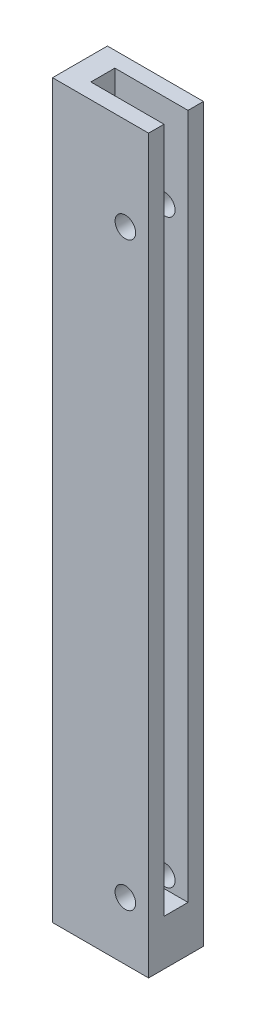
ISO-10303-21;
HEADER;
FILE_DESCRIPTION(('STEP AP214'),'2;1');
FILE_NAME('part.step','',(''),(''),'','','');
FILE_SCHEMA(('AUTOMOTIVE_DESIGN { 1 0 10303 214 1 1 1 1 }'));
ENDSEC;
DATA;
#1=APPLICATION_CONTEXT('core data for automotive mechanical design processes');
#2=APPLICATION_PROTOCOL_DEFINITION('international standard','automotive_design',2000,#1);
#3=PRODUCT_CONTEXT('',#1,'mechanical');
#4=PRODUCT('Part','Part','',(#3));
#5=PRODUCT_RELATED_PRODUCT_CATEGORY('part','',(#4));
#6=PRODUCT_DEFINITION_FORMATION('','',#4);
#7=PRODUCT_DEFINITION_CONTEXT('part definition',#1,'design');
#8=PRODUCT_DEFINITION('design','',#6,#7);
#9=PRODUCT_DEFINITION_SHAPE('','',#8);
#10=(LENGTH_UNIT() NAMED_UNIT(*) SI_UNIT(.MILLI.,.METRE.));
#11=(NAMED_UNIT(*) PLANE_ANGLE_UNIT() SI_UNIT($,.RADIAN.));
#12=(NAMED_UNIT(*) SI_UNIT($,.STERADIAN.) SOLID_ANGLE_UNIT());
#13=UNCERTAINTY_MEASURE_WITH_UNIT(LENGTH_MEASURE(1.E-05),#10,'distance_accuracy_value','');
#14=(GEOMETRIC_REPRESENTATION_CONTEXT(3) GLOBAL_UNCERTAINTY_ASSIGNED_CONTEXT((#13)) GLOBAL_UNIT_ASSIGNED_CONTEXT((#10,
#11,#12)) REPRESENTATION_CONTEXT('',''));
#15=CARTESIAN_POINT('',(0.,0.,0.));
#16=DIRECTION('',(0.,0.,1.));
#17=DIRECTION('',(1.,0.,0.));
#18=AXIS2_PLACEMENT_3D('',#15,#16,#17);
#19=CARTESIAN_POINT('',(15.92,12.7,12.));
#20=DIRECTION('',(0.,0.,-1.));
#21=DIRECTION('',(-1.,0.,0.));
#22=AXIS2_PLACEMENT_3D('',#19,#20,#21);
#23=CYLINDRICAL_SURFACE('',#22,2.2479);
#24=CARTESIAN_POINT('',(15.92,12.7,8.62499999999997));
#25=DIRECTION('',(0.,0.,1.));
#26=DIRECTION('',(0.,-1.,0.));
#27=AXIS2_PLACEMENT_3D('',#24,#25,#26);
#28=CIRCLE('',#27,2.2479);
#29=CARTESIAN_POINT('',(15.92,10.4521,8.62499999999997));
#30=VERTEX_POINT('',#29);
#31=EDGE_CURVE('E147',#30,#30,#28,.T.);
#32=ORIENTED_EDGE('',*,*,#31,.F.);
#33=EDGE_LOOP('',(#32));
#34=FACE_BOUND('',#33,.T.);
#35=CARTESIAN_POINT('',(15.92,12.7,12.));
#36=DIRECTION('',(0.,0.,1.));
#37=DIRECTION('',(1.,0.,0.));
#38=AXIS2_PLACEMENT_3D('',#35,#36,#37);
#39=CIRCLE('',#38,2.2479);
#40=CARTESIAN_POINT('',(18.1679,12.7,12.));
#41=VERTEX_POINT('',#40);
#42=EDGE_CURVE('E157',#41,#41,#39,.T.);
#43=ORIENTED_EDGE('',*,*,#42,.T.);
#44=EDGE_LOOP('',(#43));
#45=FACE_BOUND('',#44,.T.);
#46=ADVANCED_FACE('F33',(#34,#45),#23,.F.);
#47=CARTESIAN_POINT('',(15.92,139.7,12.));
#48=DIRECTION('',(0.,0.,-1.));
#49=DIRECTION('',(-1.,0.,0.));
#50=AXIS2_PLACEMENT_3D('',#47,#48,#49);
#51=CYLINDRICAL_SURFACE('',#50,2.24790000000002);
#52=CARTESIAN_POINT('',(15.92,139.7,8.62500000000002));
#53=DIRECTION('',(0.,0.,1.));
#54=DIRECTION('',(0.,-1.,0.));
#55=AXIS2_PLACEMENT_3D('',#52,#53,#54);
#56=CIRCLE('',#55,2.24790000000002);
#57=CARTESIAN_POINT('',(15.92,137.4521,8.62500000000002));
#58=VERTEX_POINT('',#57);
#59=EDGE_CURVE('E37',#58,#58,#56,.T.);
#60=ORIENTED_EDGE('',*,*,#59,.F.);
#61=EDGE_LOOP('',(#60));
#62=FACE_BOUND('',#61,.T.);
#63=CARTESIAN_POINT('',(15.92,139.7,12.));
#64=DIRECTION('',(0.,0.,1.));
#65=DIRECTION('',(1.,0.,0.));
#66=AXIS2_PLACEMENT_3D('',#63,#64,#65);
#67=CIRCLE('',#66,2.24790000000002);
#68=CARTESIAN_POINT('',(18.1679,139.7,12.));
#69=VERTEX_POINT('',#68);
#70=EDGE_CURVE('E151',#69,#69,#67,.T.);
#71=ORIENTED_EDGE('',*,*,#70,.T.);
#72=EDGE_LOOP('',(#71));
#73=FACE_BOUND('',#72,.T.);
#74=ADVANCED_FACE('F195',(#62,#73),#51,.F.);
#75=CARTESIAN_POINT('',(0.,0.,12.));
#76=DIRECTION('',(0.,0.,-1.));
#77=DIRECTION('',(-1.,0.,0.));
#78=AXIS2_PLACEMENT_3D('',#75,#76,#77);
#79=PLANE('',#78);
#80=DIRECTION('',(0.,-1.,0.));
#81=VECTOR('',#80,1.);
#82=CARTESIAN_POINT('',(0.,0.,12.));
#83=LINE('',#82,#81);
#84=CARTESIAN_POINT('',(0.,160.,12.));
#85=VERTEX_POINT('',#84);
#86=CARTESIAN_POINT('',(0.,0.,12.));
#87=VERTEX_POINT('',#86);
#88=EDGE_CURVE('E163',#85,#87,#83,.T.);
#89=ORIENTED_EDGE('',*,*,#88,.T.);
#90=DIRECTION('',(1.,0.,0.));
#91=VECTOR('',#90,1.);
#92=CARTESIAN_POINT('',(0.,0.,12.));
#93=LINE('',#92,#91);
#94=CARTESIAN_POINT('',(21.,0.,12.));
#95=VERTEX_POINT('',#94);
#96=EDGE_CURVE('E86',#87,#95,#93,.T.);
#97=ORIENTED_EDGE('',*,*,#96,.T.);
#98=DIRECTION('',(0.,1.,0.));
#99=VECTOR('',#98,1.);
#100=CARTESIAN_POINT('',(21.,0.,12.));
#101=LINE('',#100,#99);
#102=CARTESIAN_POINT('',(21.,160.,12.));
#103=VERTEX_POINT('',#102);
#104=EDGE_CURVE('E166',#95,#103,#101,.T.);
#105=ORIENTED_EDGE('',*,*,#104,.T.);
#106=DIRECTION('',(-1.,0.,0.));
#107=VECTOR('',#106,1.);
#108=CARTESIAN_POINT('',(0.,160.,12.));
#109=LINE('',#108,#107);
#110=EDGE_CURVE('E59',#103,#85,#109,.T.);
#111=ORIENTED_EDGE('',*,*,#110,.T.);
#112=EDGE_LOOP('',(#89,#97,#105,#111));
#113=FACE_BOUND('',#112,.T.);
#114=ORIENTED_EDGE('',*,*,#42,.F.);
#115=EDGE_LOOP('',(#114));
#116=FACE_BOUND('',#115,.T.);
#117=ORIENTED_EDGE('',*,*,#70,.F.);
#118=EDGE_LOOP('',(#117));
#119=FACE_BOUND('',#118,.T.);
#120=ADVANCED_FACE('F200',(#113,#116,#119),#79,.F.);
#121=CARTESIAN_POINT('',(0.,0.,0.));
#122=DIRECTION('',(0.,0.,-1.));
#123=DIRECTION('',(-1.,0.,0.));
#124=AXIS2_PLACEMENT_3D('',#121,#122,#123);
#125=PLANE('',#124);
#126=CARTESIAN_POINT('',(15.92,12.7,0.));
#127=DIRECTION('',(0.,0.,1.));
#128=DIRECTION('',(1.,0.,0.));
#129=AXIS2_PLACEMENT_3D('',#126,#127,#128);
#130=CIRCLE('',#129,2.2479);
#131=CARTESIAN_POINT('',(18.1679,12.7,0.));
#132=VERTEX_POINT('',#131);
#133=EDGE_CURVE('E154',#132,#132,#130,.T.);
#134=ORIENTED_EDGE('',*,*,#133,.T.);
#135=EDGE_LOOP('',(#134));
#136=FACE_BOUND('',#135,.T.);
#137=DIRECTION('',(0.,-1.,0.));
#138=VECTOR('',#137,1.);
#139=CARTESIAN_POINT('',(0.,0.,0.));
#140=LINE('',#139,#138);
#141=CARTESIAN_POINT('',(0.,160.,0.));
#142=VERTEX_POINT('',#141);
#143=CARTESIAN_POINT('',(0.,0.,0.));
#144=VERTEX_POINT('',#143);
#145=EDGE_CURVE('E160',#142,#144,#140,.T.);
#146=ORIENTED_EDGE('',*,*,#145,.F.);
#147=DIRECTION('',(-1.,0.,0.));
#148=VECTOR('',#147,1.);
#149=CARTESIAN_POINT('',(0.,160.,0.));
#150=LINE('',#149,#148);
#151=CARTESIAN_POINT('',(21.,160.,0.));
#152=VERTEX_POINT('',#151);
#153=EDGE_CURVE('E79',#152,#142,#150,.T.);
#154=ORIENTED_EDGE('',*,*,#153,.F.);
#155=DIRECTION('',(0.,1.,0.));
#156=VECTOR('',#155,1.);
#157=CARTESIAN_POINT('',(21.,0.,0.));
#158=LINE('',#157,#156);
#159=CARTESIAN_POINT('',(21.,0.,0.));
#160=VERTEX_POINT('',#159);
#161=EDGE_CURVE('E174',#160,#152,#158,.T.);
#162=ORIENTED_EDGE('',*,*,#161,.F.);
#163=DIRECTION('',(1.,0.,0.));
#164=VECTOR('',#163,1.);
#165=CARTESIAN_POINT('',(0.,0.,0.));
#166=LINE('',#165,#164);
#167=EDGE_CURVE('E172',#144,#160,#166,.T.);
#168=ORIENTED_EDGE('',*,*,#167,.F.);
#169=EDGE_LOOP('',(#146,#154,#162,#168));
#170=FACE_BOUND('',#169,.T.);
#171=CARTESIAN_POINT('',(15.92,139.7,0.));
#172=DIRECTION('',(0.,0.,1.));
#173=DIRECTION('',(1.,0.,0.));
#174=AXIS2_PLACEMENT_3D('',#171,#172,#173);
#175=CIRCLE('',#174,2.24790000000002);
#176=CARTESIAN_POINT('',(18.1679,139.7,0.));
#177=VERTEX_POINT('',#176);
#178=EDGE_CURVE('E150',#177,#177,#175,.T.);
#179=ORIENTED_EDGE('',*,*,#178,.T.);
#180=EDGE_LOOP('',(#179));
#181=FACE_BOUND('',#180,.T.);
#182=ADVANCED_FACE('F198',(#136,#170,#181),#125,.T.);
#183=CARTESIAN_POINT('',(0.,0.,12.));
#184=DIRECTION('',(1.,0.,0.));
#185=DIRECTION('',(0.,0.,-1.));
#186=AXIS2_PLACEMENT_3D('',#183,#184,#185);
#187=PLANE('',#186);
#188=ORIENTED_EDGE('',*,*,#145,.T.);
#189=DIRECTION('',(0.,0.,-1.));
#190=VECTOR('',#189,1.);
#191=CARTESIAN_POINT('',(0.,0.,12.));
#192=LINE('',#191,#190);
#193=EDGE_CURVE('E11',#87,#144,#192,.T.);
#194=ORIENTED_EDGE('',*,*,#193,.F.);
#195=ORIENTED_EDGE('',*,*,#88,.F.);
#196=DIRECTION('',(0.,0.,-1.));
#197=VECTOR('',#196,1.);
#198=CARTESIAN_POINT('',(0.,160.,12.));
#199=LINE('',#198,#197);
#200=EDGE_CURVE('E169',#85,#142,#199,.T.);
#201=ORIENTED_EDGE('',*,*,#200,.T.);
#202=EDGE_LOOP('',(#188,#194,#195,#201));
#203=FACE_BOUND('',#202,.T.);
#204=ADVANCED_FACE('F35',(#203),#187,.F.);
#205=CARTESIAN_POINT('',(0.,0.,12.));
#206=DIRECTION('',(0.,1.,0.));
#207=DIRECTION('',(0.,0.,1.));
#208=AXIS2_PLACEMENT_3D('',#205,#206,#207);
#209=PLANE('',#208);
#210=ORIENTED_EDGE('',*,*,#167,.T.);
#211=DIRECTION('',(0.,0.,-1.));
#212=VECTOR('',#211,1.);
#213=CARTESIAN_POINT('',(21.,0.,12.));
#214=LINE('',#213,#212);
#215=EDGE_CURVE('E42',#95,#160,#214,.T.);
#216=ORIENTED_EDGE('',*,*,#215,.F.);
#217=ORIENTED_EDGE('',*,*,#96,.F.);
#218=ORIENTED_EDGE('',*,*,#193,.T.);
#219=EDGE_LOOP('',(#210,#216,#217,#218));
#220=FACE_BOUND('',#219,.T.);
#221=ADVANCED_FACE('F207',(#220),#209,.F.);
#222=CARTESIAN_POINT('',(21.,0.,12.));
#223=DIRECTION('',(-1.,0.,0.));
#224=DIRECTION('',(0.,0.,1.));
#225=AXIS2_PLACEMENT_3D('',#222,#223,#224);
#226=PLANE('',#225);
#227=DIRECTION('',(0.,0.,-1.));
#228=VECTOR('',#227,1.);
#229=CARTESIAN_POINT('',(21.,10.,8.62499999999997));
#230=LINE('',#229,#228);
#231=CARTESIAN_POINT('',(21.,10.,8.62499999999997));
#232=VERTEX_POINT('',#231);
#233=CARTESIAN_POINT('',(21.,10.,3.37499999999998));
#234=VERTEX_POINT('',#233);
#235=EDGE_CURVE('E130',#232,#234,#230,.T.);
#236=ORIENTED_EDGE('',*,*,#235,.F.);
#237=DIRECTION('',(0.,-1.,0.));
#238=VECTOR('',#237,1.);
#239=CARTESIAN_POINT('',(21.,10.,8.62499999999997));
#240=LINE('',#239,#238);
#241=CARTESIAN_POINT('',(21.,160.,8.62500000000003));
#242=VERTEX_POINT('',#241);
#243=EDGE_CURVE('E115',#242,#232,#240,.T.);
#244=ORIENTED_EDGE('',*,*,#243,.F.);
#245=DIRECTION('',(0.,0.,-1.));
#246=VECTOR('',#245,1.);
#247=CARTESIAN_POINT('',(21.,160.,12.));
#248=LINE('',#247,#246);
#249=EDGE_CURVE('E180',#103,#242,#248,.T.);
#250=ORIENTED_EDGE('',*,*,#249,.F.);
#251=ORIENTED_EDGE('',*,*,#104,.F.);
#252=ORIENTED_EDGE('',*,*,#215,.T.);
#253=ORIENTED_EDGE('',*,*,#161,.T.);
#254=CARTESIAN_POINT('',(21.,160.,3.37499999999998));
#255=VERTEX_POINT('',#254);
#256=EDGE_CURVE('E179',#255,#152,#248,.T.);
#257=ORIENTED_EDGE('',*,*,#256,.F.);
#258=DIRECTION('',(0.,1.,0.));
#259=VECTOR('',#258,1.);
#260=CARTESIAN_POINT('',(21.,10.,3.37499999999998));
#261=LINE('',#260,#259);
#262=EDGE_CURVE('E128',#234,#255,#261,.T.);
#263=ORIENTED_EDGE('',*,*,#262,.F.);
#264=EDGE_LOOP('',(#236,#244,#250,#251,#252,#253,#257,#263));
#265=FACE_BOUND('',#264,.T.);
#266=ADVANCED_FACE('F227',(#265),#226,.F.);
#267=CARTESIAN_POINT('',(0.,160.,12.));
#268=DIRECTION('',(0.,-1.,0.));
#269=DIRECTION('',(0.,0.,-1.));
#270=AXIS2_PLACEMENT_3D('',#267,#268,#269);
#271=PLANE('',#270);
#272=ORIENTED_EDGE('',*,*,#249,.T.);
#273=DIRECTION('',(1.,0.,0.));
#274=VECTOR('',#273,1.);
#275=CARTESIAN_POINT('',(5.,160.,8.62500000000003));
#276=LINE('',#275,#274);
#277=CARTESIAN_POINT('',(5.,160.,8.62500000000003));
#278=VERTEX_POINT('',#277);
#279=EDGE_CURVE('E137',#278,#242,#276,.T.);
#280=ORIENTED_EDGE('',*,*,#279,.F.);
#281=DIRECTION('',(0.,0.,1.));
#282=VECTOR('',#281,1.);
#283=CARTESIAN_POINT('',(5.,160.,8.62500000000003));
#284=LINE('',#283,#282);
#285=CARTESIAN_POINT('',(5.,160.,3.37499999999998));
#286=VERTEX_POINT('',#285);
#287=EDGE_CURVE('E120',#286,#278,#284,.T.);
#288=ORIENTED_EDGE('',*,*,#287,.F.);
#289=DIRECTION('',(1.,0.,0.));
#290=VECTOR('',#289,1.);
#291=CARTESIAN_POINT('',(5.,160.,3.37499999999998));
#292=LINE('',#291,#290);
#293=EDGE_CURVE('E140',#286,#255,#292,.T.);
#294=ORIENTED_EDGE('',*,*,#293,.T.);
#295=ORIENTED_EDGE('',*,*,#256,.T.);
#296=ORIENTED_EDGE('',*,*,#153,.T.);
#297=ORIENTED_EDGE('',*,*,#200,.F.);
#298=ORIENTED_EDGE('',*,*,#110,.F.);
#299=EDGE_LOOP('',(#272,#280,#288,#294,#295,#296,#297,#298));
#300=FACE_BOUND('',#299,.T.);
#301=ADVANCED_FACE('F222',(#300),#271,.F.);
#302=CARTESIAN_POINT('',(15.92,12.7,3.37499999999998));
#303=DIRECTION('',(0.,0.,-1.));
#304=DIRECTION('',(0.,1.,0.));
#305=AXIS2_PLACEMENT_3D('',#302,#303,#304);
#306=CIRCLE('',#305,2.2479);
#307=CARTESIAN_POINT('',(15.92,14.9479,3.37499999999998));
#308=VERTEX_POINT('',#307);
#309=EDGE_CURVE('E144',#308,#308,#306,.T.);
#310=ORIENTED_EDGE('',*,*,#309,.F.);
#311=EDGE_LOOP('',(#310));
#312=FACE_BOUND('',#311,.T.);
#313=ORIENTED_EDGE('',*,*,#133,.F.);
#314=EDGE_LOOP('',(#313));
#315=FACE_BOUND('',#314,.T.);
#316=ADVANCED_FACE('F193',(#312,#315),#23,.F.);
#317=CARTESIAN_POINT('',(15.92,139.7,3.37499999999998));
#318=DIRECTION('',(0.,0.,-1.));
#319=DIRECTION('',(0.,1.,0.));
#320=AXIS2_PLACEMENT_3D('',#317,#318,#319);
#321=CIRCLE('',#320,2.24790000000002);
#322=CARTESIAN_POINT('',(15.92,141.9479,3.37499999999998));
#323=VERTEX_POINT('',#322);
#324=EDGE_CURVE('E139',#323,#323,#321,.T.);
#325=ORIENTED_EDGE('',*,*,#324,.F.);
#326=EDGE_LOOP('',(#325));
#327=FACE_BOUND('',#326,.T.);
#328=ORIENTED_EDGE('',*,*,#178,.F.);
#329=EDGE_LOOP('',(#328));
#330=FACE_BOUND('',#329,.T.);
#331=ADVANCED_FACE('F190',(#327,#330),#51,.F.);
#332=CARTESIAN_POINT('',(5.,10.,8.62499999999997));
#333=DIRECTION('',(0.,0.,1.));
#334=DIRECTION('',(0.,-1.,0.));
#335=AXIS2_PLACEMENT_3D('',#332,#333,#334);
#336=PLANE('',#335);
#337=ORIENTED_EDGE('',*,*,#31,.T.);
#338=EDGE_LOOP('',(#337));
#339=FACE_BOUND('',#338,.T.);
#340=ORIENTED_EDGE('',*,*,#59,.T.);
#341=EDGE_LOOP('',(#340));
#342=FACE_BOUND('',#341,.T.);
#343=ORIENTED_EDGE('',*,*,#243,.T.);
#344=DIRECTION('',(1.,0.,0.));
#345=VECTOR('',#344,1.);
#346=CARTESIAN_POINT('',(5.,10.,8.62499999999997));
#347=LINE('',#346,#345);
#348=CARTESIAN_POINT('',(5.,10.,8.62499999999997));
#349=VERTEX_POINT('',#348);
#350=EDGE_CURVE('E109',#349,#232,#347,.T.);
#351=ORIENTED_EDGE('',*,*,#350,.F.);
#352=DIRECTION('',(0.,-1.,0.));
#353=VECTOR('',#352,1.);
#354=CARTESIAN_POINT('',(5.,10.,8.62499999999997));
#355=LINE('',#354,#353);
#356=EDGE_CURVE('E113',#278,#349,#355,.T.);
#357=ORIENTED_EDGE('',*,*,#356,.F.);
#358=ORIENTED_EDGE('',*,*,#279,.T.);
#359=EDGE_LOOP('',(#343,#351,#357,#358));
#360=FACE_BOUND('',#359,.T.);
#361=ADVANCED_FACE('F111',(#339,#342,#360),#336,.F.);
#362=CARTESIAN_POINT('',(5.,10.,3.37499999999998));
#363=DIRECTION('',(0.,0.,-1.));
#364=DIRECTION('',(0.,1.,0.));
#365=AXIS2_PLACEMENT_3D('',#362,#363,#364);
#366=PLANE('',#365);
#367=ORIENTED_EDGE('',*,*,#309,.T.);
#368=EDGE_LOOP('',(#367));
#369=FACE_BOUND('',#368,.T.);
#370=ORIENTED_EDGE('',*,*,#324,.T.);
#371=EDGE_LOOP('',(#370));
#372=FACE_BOUND('',#371,.T.);
#373=ORIENTED_EDGE('',*,*,#262,.T.);
#374=ORIENTED_EDGE('',*,*,#293,.F.);
#375=DIRECTION('',(0.,1.,0.));
#376=VECTOR('',#375,1.);
#377=CARTESIAN_POINT('',(5.,10.,3.37499999999998));
#378=LINE('',#377,#376);
#379=CARTESIAN_POINT('',(5.,10.,3.37499999999998));
#380=VERTEX_POINT('',#379);
#381=EDGE_CURVE('E50',#380,#286,#378,.T.);
#382=ORIENTED_EDGE('',*,*,#381,.F.);
#383=DIRECTION('',(1.,0.,0.));
#384=VECTOR('',#383,1.);
#385=CARTESIAN_POINT('',(5.,10.,3.37499999999998));
#386=LINE('',#385,#384);
#387=EDGE_CURVE('E119',#380,#234,#386,.T.);
#388=ORIENTED_EDGE('',*,*,#387,.T.);
#389=EDGE_LOOP('',(#373,#374,#382,#388));
#390=FACE_BOUND('',#389,.T.);
#391=ADVANCED_FACE('F187',(#369,#372,#390),#366,.F.);
#392=CARTESIAN_POINT('',(5.,10.,8.62499999999997));
#393=DIRECTION('',(0.,-1.,0.));
#394=DIRECTION('',(0.,0.,-1.));
#395=AXIS2_PLACEMENT_3D('',#392,#393,#394);
#396=PLANE('',#395);
#397=ORIENTED_EDGE('',*,*,#235,.T.);
#398=ORIENTED_EDGE('',*,*,#387,.F.);
#399=DIRECTION('',(0.,0.,-1.));
#400=VECTOR('',#399,1.);
#401=CARTESIAN_POINT('',(5.,10.,8.62499999999997));
#402=LINE('',#401,#400);
#403=EDGE_CURVE('E122',#349,#380,#402,.T.);
#404=ORIENTED_EDGE('',*,*,#403,.F.);
#405=ORIENTED_EDGE('',*,*,#350,.T.);
#406=EDGE_LOOP('',(#397,#398,#404,#405));
#407=FACE_BOUND('',#406,.T.);
#408=ADVANCED_FACE('F123',(#407),#396,.F.);
#409=CARTESIAN_POINT('',(5.,0.,0.));
#410=DIRECTION('',(-1.,0.,0.));
#411=DIRECTION('',(0.,0.,1.));
#412=AXIS2_PLACEMENT_3D('',#409,#410,#411);
#413=PLANE('',#412);
#414=ORIENTED_EDGE('',*,*,#356,.T.);
#415=ORIENTED_EDGE('',*,*,#403,.T.);
#416=ORIENTED_EDGE('',*,*,#381,.T.);
#417=ORIENTED_EDGE('',*,*,#287,.T.);
#418=EDGE_LOOP('',(#414,#415,#416,#417));
#419=FACE_BOUND('',#418,.T.);
#420=ADVANCED_FACE('F125',(#419),#413,.F.);
#421=CLOSED_SHELL('',(#46,#74,#120,#182,#204,#221,#266,#301,#316,#331,#361,#391,#408,#420));
#422=MANIFOLD_SOLID_BREP('B2',#421);
#423=ADVANCED_BREP_SHAPE_REPRESENTATION('',(#18,#422),#14);
#424=SHAPE_DEFINITION_REPRESENTATION(#9,#423);
ENDSEC;
END-ISO-10303-21;
